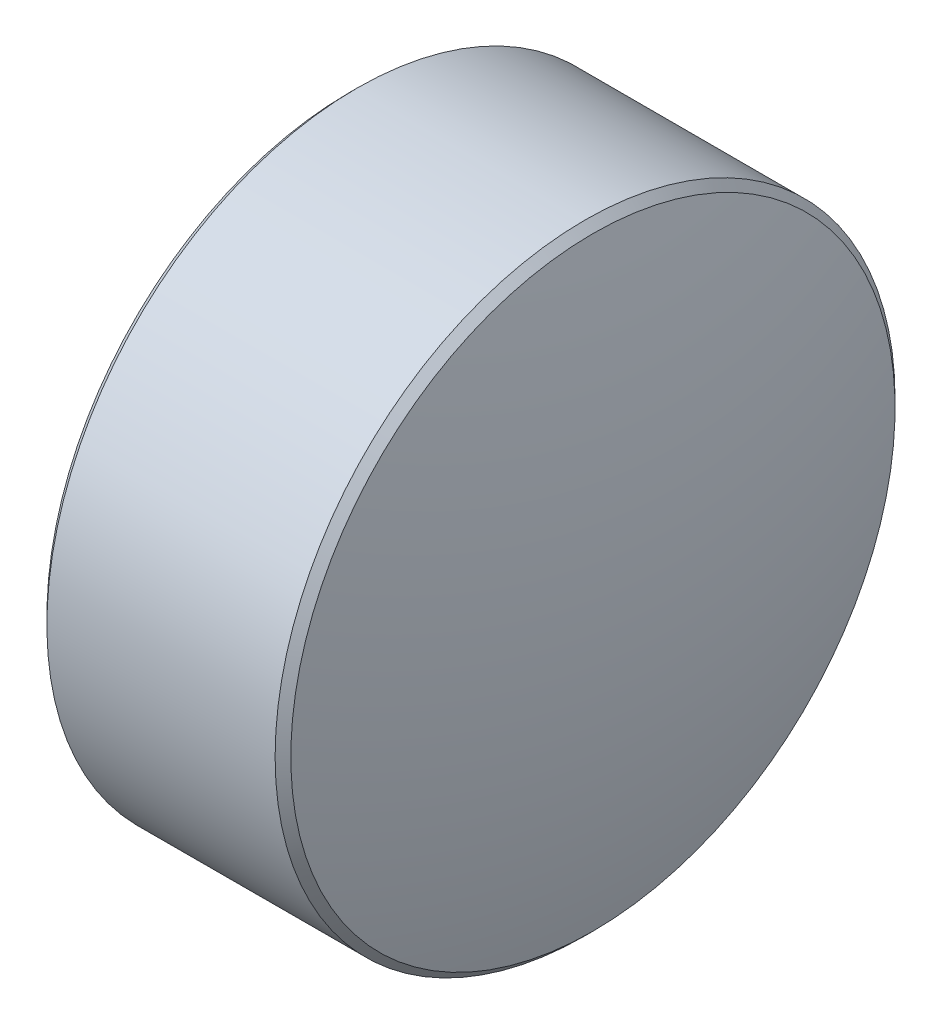
ISO-10303-21;
HEADER;
FILE_DESCRIPTION(('STEP AP214'),'2;1');
FILE_NAME('part.step','',(''),(''),'','','');
FILE_SCHEMA(('AUTOMOTIVE_DESIGN { 1 0 10303 214 1 1 1 1 }'));
ENDSEC;
DATA;
#1=APPLICATION_CONTEXT('core data for automotive mechanical design processes');
#2=APPLICATION_PROTOCOL_DEFINITION('international standard','automotive_design',2000,#1);
#3=PRODUCT_CONTEXT('',#1,'mechanical');
#4=PRODUCT('Part','Part','',(#3));
#5=PRODUCT_RELATED_PRODUCT_CATEGORY('part','',(#4));
#6=PRODUCT_DEFINITION_FORMATION('','',#4);
#7=PRODUCT_DEFINITION_CONTEXT('part definition',#1,'design');
#8=PRODUCT_DEFINITION('design','',#6,#7);
#9=PRODUCT_DEFINITION_SHAPE('','',#8);
#10=(LENGTH_UNIT() NAMED_UNIT(*) SI_UNIT(.MILLI.,.METRE.));
#11=(NAMED_UNIT(*) PLANE_ANGLE_UNIT() SI_UNIT($,.RADIAN.));
#12=(NAMED_UNIT(*) SI_UNIT($,.STERADIAN.) SOLID_ANGLE_UNIT());
#13=UNCERTAINTY_MEASURE_WITH_UNIT(LENGTH_MEASURE(1.E-05),#10,'distance_accuracy_value','');
#14=(GEOMETRIC_REPRESENTATION_CONTEXT(3) GLOBAL_UNCERTAINTY_ASSIGNED_CONTEXT((#13)) GLOBAL_UNIT_ASSIGNED_CONTEXT((#10,
#11,#12)) REPRESENTATION_CONTEXT('',''));
#15=CARTESIAN_POINT('',(0.,0.,0.));
#16=DIRECTION('',(0.,0.,1.));
#17=DIRECTION('',(1.,0.,0.));
#18=AXIS2_PLACEMENT_3D('',#15,#16,#17);
#19=CARTESIAN_POINT('',(-34.2077690460588,0.,0.));
#20=DIRECTION('',(1.,0.,0.));
#21=DIRECTION('',(0.,-1.,0.));
#22=AXIS2_PLACEMENT_3D('',#19,#20,#21);
#23=SPHERICAL_SURFACE('',#22,40.);
#24=CARTESIAN_POINT('',(4.32859717393078,0.,0.));
#25=DIRECTION('',(-1.,0.,0.));
#26=DIRECTION('',(0.,-1.,0.));
#27=AXIS2_PLACEMENT_3D('',#24,#25,#26);
#28=CIRCLE('',#27,10.7214028260692);
#29=CARTESIAN_POINT('',(4.32859717393078,-10.7214028260692,0.));
#30=VERTEX_POINT('',#29);
#31=EDGE_CURVE('E48',#30,#30,#28,.F.);
#32=ORIENTED_EDGE('',*,*,#31,.T.);
#33=EDGE_LOOP('',(#32));
#34=FACE_BOUND('',#33,.T.);
#35=ADVANCED_FACE('F33',(#34),#23,.T.);
#36=CARTESIAN_POINT('',(20.6853952685388,0.,0.));
#37=DIRECTION('',(1.,0.,0.));
#38=DIRECTION('',(0.,1.,0.));
#39=AXIS2_PLACEMENT_3D('',#36,#37,#38);
#40=CYLINDRICAL_SURFACE('',#39,11.);
#41=CARTESIAN_POINT('',(4.05,0.,0.));
#42=DIRECTION('',(1.,0.,0.));
#43=DIRECTION('',(0.,1.,0.));
#44=AXIS2_PLACEMENT_3D('',#41,#42,#43);
#45=CIRCLE('',#44,11.);
#46=CARTESIAN_POINT('',(4.05,11.,0.));
#47=VERTEX_POINT('',#46);
#48=EDGE_CURVE('E40',#47,#47,#45,.F.);
#49=ORIENTED_EDGE('',*,*,#48,.T.);
#50=EDGE_LOOP('',(#49));
#51=FACE_BOUND('',#50,.T.);
#52=CARTESIAN_POINT('',(-4.04889055407614,0.,0.));
#53=DIRECTION('',(1.,0.,0.));
#54=DIRECTION('',(0.,1.,0.));
#55=AXIS2_PLACEMENT_3D('',#52,#53,#54);
#56=CIRCLE('',#55,11.);
#57=CARTESIAN_POINT('',(-4.04889055407614,11.,0.));
#58=VERTEX_POINT('',#57);
#59=EDGE_CURVE('E44',#58,#58,#56,.T.);
#60=ORIENTED_EDGE('',*,*,#59,.T.);
#61=EDGE_LOOP('',(#60));
#62=FACE_BOUND('',#61,.T.);
#63=ADVANCED_FACE('F64',(#51,#62),#40,.T.);
#64=CARTESIAN_POINT('',(34.2077690460588,0.,0.));
#65=DIRECTION('',(1.,0.,0.));
#66=DIRECTION('',(0.,1.,0.));
#67=AXIS2_PLACEMENT_3D('',#64,#65,#66);
#68=SPHERICAL_SURFACE('',#67,40.);
#69=CARTESIAN_POINT('',(-4.32959334773098,0.,0.));
#70=DIRECTION('',(1.,0.,0.));
#71=DIRECTION('',(0.,1.,0.));
#72=AXIS2_PLACEMENT_3D('',#69,#70,#71);
#73=CIRCLE('',#72,10.7178215944153);
#74=CARTESIAN_POINT('',(-4.32959334773098,10.7178215944153,0.));
#75=VERTEX_POINT('',#74);
#76=EDGE_CURVE('E10',#75,#75,#73,.F.);
#77=ORIENTED_EDGE('',*,*,#76,.T.);
#78=EDGE_LOOP('',(#77));
#79=FACE_BOUND('',#78,.T.);
#80=ADVANCED_FACE('F57',(#79),#68,.T.);
#81=CARTESIAN_POINT('',(4.32859717393077,0.,0.));
#82=DIRECTION('',(-1.,0.,0.));
#83=DIRECTION('',(0.,-1.,0.));
#84=AXIS2_PLACEMENT_3D('',#81,#82,#83);
#85=CONICAL_SURFACE('',#84,10.7214028260692,0.785398163397451);
#86=ORIENTED_EDGE('',*,*,#48,.F.);
#87=EDGE_LOOP('',(#86));
#88=FACE_BOUND('',#87,.T.);
#89=ORIENTED_EDGE('',*,*,#31,.F.);
#90=EDGE_LOOP('',(#89));
#91=FACE_BOUND('',#90,.T.);
#92=ADVANCED_FACE('F55',(#88,#91),#85,.T.);
#93=CARTESIAN_POINT('',(-4.04889055407614,0.,0.));
#94=DIRECTION('',(1.,0.,0.));
#95=DIRECTION('',(0.,1.,0.));
#96=AXIS2_PLACEMENT_3D('',#93,#94,#95);
#97=CONICAL_SURFACE('',#96,11.,0.788019690908912);
#98=ORIENTED_EDGE('',*,*,#76,.F.);
#99=EDGE_LOOP('',(#98));
#100=FACE_BOUND('',#99,.T.);
#101=ORIENTED_EDGE('',*,*,#59,.F.);
#102=EDGE_LOOP('',(#101));
#103=FACE_BOUND('',#102,.T.);
#104=ADVANCED_FACE('F35',(#100,#103),#97,.T.);
#105=CLOSED_SHELL('',(#35,#63,#80,#92,#104));
#106=MANIFOLD_SOLID_BREP('B2',#105);
#107=ADVANCED_BREP_SHAPE_REPRESENTATION('',(#18,#106),#14);
#108=SHAPE_DEFINITION_REPRESENTATION(#9,#107);
ENDSEC;
END-ISO-10303-21;
